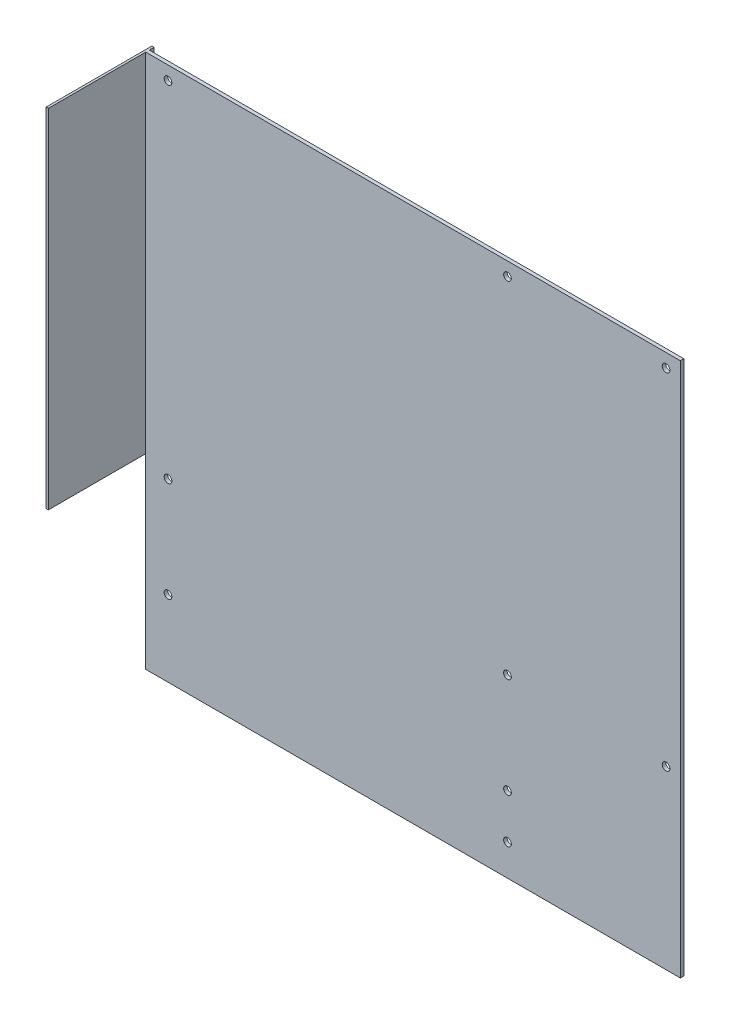
ISO-10303-21;
HEADER;
FILE_DESCRIPTION(('STEP AP214'),'2;1');
FILE_NAME('part.step','',(''),(''),'','','');
FILE_SCHEMA(('AUTOMOTIVE_DESIGN { 1 0 10303 214 1 1 1 1 }'));
ENDSEC;
DATA;
#1=APPLICATION_CONTEXT('core data for automotive mechanical design processes');
#2=APPLICATION_PROTOCOL_DEFINITION('international standard','automotive_design',2000,#1);
#3=PRODUCT_CONTEXT('',#1,'mechanical');
#4=PRODUCT('Part','Part','',(#3));
#5=PRODUCT_RELATED_PRODUCT_CATEGORY('part','',(#4));
#6=PRODUCT_DEFINITION_FORMATION('','',#4);
#7=PRODUCT_DEFINITION_CONTEXT('part definition',#1,'design');
#8=PRODUCT_DEFINITION('design','',#6,#7);
#9=PRODUCT_DEFINITION_SHAPE('','',#8);
#10=(LENGTH_UNIT() NAMED_UNIT(*) SI_UNIT(.MILLI.,.METRE.));
#11=(NAMED_UNIT(*) PLANE_ANGLE_UNIT() SI_UNIT($,.RADIAN.));
#12=(NAMED_UNIT(*) SI_UNIT($,.STERADIAN.) SOLID_ANGLE_UNIT());
#13=UNCERTAINTY_MEASURE_WITH_UNIT(LENGTH_MEASURE(1.E-05),#10,'distance_accuracy_value','');
#14=(GEOMETRIC_REPRESENTATION_CONTEXT(3) GLOBAL_UNCERTAINTY_ASSIGNED_CONTEXT((#13)) GLOBAL_UNIT_ASSIGNED_CONTEXT((#10,
#11,#12)) REPRESENTATION_CONTEXT('',''));
#15=CARTESIAN_POINT('',(0.,0.,0.));
#16=DIRECTION('',(0.,0.,1.));
#17=DIRECTION('',(1.,0.,0.));
#18=AXIS2_PLACEMENT_3D('',#15,#16,#17);
#19=CARTESIAN_POINT('',(0.,244.,1.6));
#20=DIRECTION('',(1.,0.,0.));
#21=DIRECTION('',(0.,1.,0.));
#22=AXIS2_PLACEMENT_3D('',#19,#20,#21);
#23=PLANE('',#22);
#24=DIRECTION('',(0.,0.,1.));
#25=VECTOR('',#24,1.);
#26=CARTESIAN_POINT('',(0.,85.25,-2.21));
#27=LINE('',#26,#25);
#28=CARTESIAN_POINT('',(0.,85.25,0.));
#29=VERTEX_POINT('',#28);
#30=CARTESIAN_POINT('',(0.,85.25,1.6));
#31=VERTEX_POINT('',#30);
#32=EDGE_CURVE('E11',#29,#31,#27,.T.);
#33=ORIENTED_EDGE('',*,*,#32,.F.);
#34=DIRECTION('',(0.,-1.,0.));
#35=VECTOR('',#34,1.);
#36=CARTESIAN_POINT('',(0.,244.,0.));
#37=LINE('',#36,#35);
#38=CARTESIAN_POINT('',(0.,0.,0.));
#39=VERTEX_POINT('',#38);
#40=EDGE_CURVE('E250',#29,#39,#37,.T.);
#41=ORIENTED_EDGE('',*,*,#40,.T.);
#42=DIRECTION('',(0.,0.,-1.));
#43=VECTOR('',#42,1.);
#44=CARTESIAN_POINT('',(0.,0.,1.6));
#45=LINE('',#44,#43);
#46=CARTESIAN_POINT('',(0.,0.,1.6));
#47=VERTEX_POINT('',#46);
#48=EDGE_CURVE('E48',#47,#39,#45,.T.);
#49=ORIENTED_EDGE('',*,*,#48,.F.);
#50=DIRECTION('',(0.,-1.,0.));
#51=VECTOR('',#50,1.);
#52=CARTESIAN_POINT('',(0.,244.,1.6));
#53=LINE('',#52,#51);
#54=EDGE_CURVE('E96',#31,#47,#53,.T.);
#55=ORIENTED_EDGE('',*,*,#54,.F.);
#56=EDGE_LOOP('',(#33,#41,#49,#55));
#57=FACE_BOUND('',#56,.T.);
#58=ADVANCED_FACE('F45',(#57),#23,.F.);
#59=CARTESIAN_POINT('',(0.,0.,1.6));
#60=DIRECTION('',(0.,1.,0.));
#61=DIRECTION('',(0.,0.,1.));
#62=AXIS2_PLACEMENT_3D('',#59,#60,#61);
#63=PLANE('',#62);
#64=DIRECTION('',(1.,0.,0.));
#65=VECTOR('',#64,1.);
#66=CARTESIAN_POINT('',(0.,0.,0.));
#67=LINE('',#66,#65);
#68=CARTESIAN_POINT('',(244.,0.,0.));
#69=VERTEX_POINT('',#68);
#70=EDGE_CURVE('E269',#39,#69,#67,.T.);
#71=ORIENTED_EDGE('',*,*,#70,.T.);
#72=DIRECTION('',(0.,0.,-1.));
#73=VECTOR('',#72,1.);
#74=CARTESIAN_POINT('',(244.,0.,1.6));
#75=LINE('',#74,#73);
#76=CARTESIAN_POINT('',(244.,0.,1.6));
#77=VERTEX_POINT('',#76);
#78=EDGE_CURVE('E278',#77,#69,#75,.T.);
#79=ORIENTED_EDGE('',*,*,#78,.F.);
#80=DIRECTION('',(1.,0.,0.));
#81=VECTOR('',#80,1.);
#82=CARTESIAN_POINT('',(0.,0.,1.6));
#83=LINE('',#82,#81);
#84=EDGE_CURVE('E256',#47,#77,#83,.T.);
#85=ORIENTED_EDGE('',*,*,#84,.F.);
#86=ORIENTED_EDGE('',*,*,#48,.T.);
#87=EDGE_LOOP('',(#71,#79,#85,#86));
#88=FACE_BOUND('',#87,.T.);
#89=ADVANCED_FACE('F289',(#88),#63,.F.);
#90=CARTESIAN_POINT('',(244.,0.,1.6));
#91=DIRECTION('',(-1.,0.,0.));
#92=DIRECTION('',(0.,0.,1.));
#93=AXIS2_PLACEMENT_3D('',#90,#91,#92);
#94=PLANE('',#93);
#95=DIRECTION('',(0.,1.,0.));
#96=VECTOR('',#95,1.);
#97=CARTESIAN_POINT('',(244.,0.,0.));
#98=LINE('',#97,#96);
#99=CARTESIAN_POINT('',(244.,244.,0.));
#100=VERTEX_POINT('',#99);
#101=EDGE_CURVE('E272',#69,#100,#98,.T.);
#102=ORIENTED_EDGE('',*,*,#101,.T.);
#103=DIRECTION('',(0.,0.,-1.));
#104=VECTOR('',#103,1.);
#105=CARTESIAN_POINT('',(244.,244.,1.6));
#106=LINE('',#105,#104);
#107=CARTESIAN_POINT('',(244.,244.,1.6));
#108=VERTEX_POINT('',#107);
#109=EDGE_CURVE('E264',#108,#100,#106,.T.);
#110=ORIENTED_EDGE('',*,*,#109,.F.);
#111=DIRECTION('',(0.,1.,0.));
#112=VECTOR('',#111,1.);
#113=CARTESIAN_POINT('',(244.,0.,1.6));
#114=LINE('',#113,#112);
#115=EDGE_CURVE('E259',#77,#108,#114,.T.);
#116=ORIENTED_EDGE('',*,*,#115,.F.);
#117=ORIENTED_EDGE('',*,*,#78,.T.);
#118=EDGE_LOOP('',(#102,#110,#116,#117));
#119=FACE_BOUND('',#118,.T.);
#120=ADVANCED_FACE('F295',(#119),#94,.F.);
#121=CARTESIAN_POINT('',(244.,244.,1.6));
#122=DIRECTION('',(0.,-1.,0.));
#123=DIRECTION('',(1.,0.,0.));
#124=AXIS2_PLACEMENT_3D('',#121,#122,#123);
#125=PLANE('',#124);
#126=DIRECTION('',(-1.,0.,0.));
#127=VECTOR('',#126,1.);
#128=CARTESIAN_POINT('',(244.,244.,0.));
#129=LINE('',#128,#127);
#130=CARTESIAN_POINT('',(0.,244.,0.));
#131=VERTEX_POINT('',#130);
#132=EDGE_CURVE('E91',#100,#131,#129,.T.);
#133=ORIENTED_EDGE('',*,*,#132,.T.);
#134=DIRECTION('',(0.,0.,1.));
#135=VECTOR('',#134,1.);
#136=CARTESIAN_POINT('',(0.,244.,-2.21));
#137=LINE('',#136,#135);
#138=CARTESIAN_POINT('',(0.,244.,-2.21));
#139=VERTEX_POINT('',#138);
#140=EDGE_CURVE('E133',#139,#131,#137,.T.);
#141=ORIENTED_EDGE('',*,*,#140,.F.);
#142=DIRECTION('',(-1.,0.,0.));
#143=VECTOR('',#142,1.);
#144=CARTESIAN_POINT('',(0.,244.,-2.21));
#145=LINE('',#144,#143);
#146=CARTESIAN_POINT('',(-1.,244.,-2.21));
#147=VERTEX_POINT('',#146);
#148=EDGE_CURVE('E162',#139,#147,#145,.T.);
#149=ORIENTED_EDGE('',*,*,#148,.T.);
#150=DIRECTION('',(0.,0.,1.));
#151=VECTOR('',#150,1.);
#152=CARTESIAN_POINT('',(-1.,244.,-2.21));
#153=LINE('',#152,#151);
#154=CARTESIAN_POINT('',(-1.,244.,46.05));
#155=VERTEX_POINT('',#154);
#156=EDGE_CURVE('E140',#147,#155,#153,.T.);
#157=ORIENTED_EDGE('',*,*,#156,.T.);
#158=DIRECTION('',(-1.,0.,0.));
#159=VECTOR('',#158,1.);
#160=CARTESIAN_POINT('',(0.,244.,46.05));
#161=LINE('',#160,#159);
#162=CARTESIAN_POINT('',(0.,244.,46.05));
#163=VERTEX_POINT('',#162);
#164=EDGE_CURVE('E137',#163,#155,#161,.T.);
#165=ORIENTED_EDGE('',*,*,#164,.F.);
#166=CARTESIAN_POINT('',(0.,244.,1.6));
#167=VERTEX_POINT('',#166);
#168=EDGE_CURVE('E125',#167,#163,#137,.T.);
#169=ORIENTED_EDGE('',*,*,#168,.F.);
#170=DIRECTION('',(-1.,0.,0.));
#171=VECTOR('',#170,1.);
#172=CARTESIAN_POINT('',(244.,244.,1.6));
#173=LINE('',#172,#171);
#174=EDGE_CURVE('E70',#108,#167,#173,.T.);
#175=ORIENTED_EDGE('',*,*,#174,.F.);
#176=ORIENTED_EDGE('',*,*,#109,.T.);
#177=EDGE_LOOP('',(#133,#141,#149,#157,#165,#169,#175,#176));
#178=FACE_BOUND('',#177,.T.);
#179=ADVANCED_FACE('F138',(#178),#125,.F.);
#180=CARTESIAN_POINT('',(0.,0.,1.6));
#181=DIRECTION('',(0.,0.,1.));
#182=DIRECTION('',(1.,0.,0.));
#183=AXIS2_PLACEMENT_3D('',#180,#181,#182);
#184=PLANE('',#183);
#185=CARTESIAN_POINT('',(165.1,14.31,1.6));
#186=DIRECTION('',(0.,0.,1.));
#187=DIRECTION('',(1.,0.,0.));
#188=AXIS2_PLACEMENT_3D('',#185,#186,#187);
#189=CIRCLE('',#188,1.75000000000001);
#190=CARTESIAN_POINT('',(166.85,14.31,1.6));
#191=VERTEX_POINT('',#190);
#192=EDGE_CURVE('E214',#191,#191,#189,.T.);
#193=ORIENTED_EDGE('',*,*,#192,.F.);
#194=EDGE_LOOP('',(#193));
#195=FACE_BOUND('',#194,.T.);
#196=CARTESIAN_POINT('',(165.1,34.6299999999999,1.6));
#197=DIRECTION('',(0.,0.,1.));
#198=DIRECTION('',(1.,0.,0.));
#199=AXIS2_PLACEMENT_3D('',#196,#197,#198);
#200=CIRCLE('',#199,1.75000000000001);
#201=CARTESIAN_POINT('',(166.85,34.6299999999999,1.6));
#202=VERTEX_POINT('',#201);
#203=EDGE_CURVE('E223',#202,#202,#200,.T.);
#204=ORIENTED_EDGE('',*,*,#203,.F.);
#205=EDGE_LOOP('',(#204));
#206=FACE_BOUND('',#205,.T.);
#207=CARTESIAN_POINT('',(10.16,80.35,1.6));
#208=DIRECTION('',(0.,0.,1.));
#209=DIRECTION('',(1.,0.,0.));
#210=AXIS2_PLACEMENT_3D('',#207,#208,#209);
#211=CIRCLE('',#210,1.75);
#212=CARTESIAN_POINT('',(11.91,80.35,1.6));
#213=VERTEX_POINT('',#212);
#214=EDGE_CURVE('E231',#213,#213,#211,.T.);
#215=ORIENTED_EDGE('',*,*,#214,.F.);
#216=EDGE_LOOP('',(#215));
#217=FACE_BOUND('',#216,.T.);
#218=CARTESIAN_POINT('',(165.1,80.3499999999999,1.6));
#219=DIRECTION('',(0.,0.,1.));
#220=DIRECTION('',(1.,0.,0.));
#221=AXIS2_PLACEMENT_3D('',#218,#219,#220);
#222=CIRCLE('',#221,1.75000000000001);
#223=CARTESIAN_POINT('',(166.85,80.3499999999999,1.6));
#224=VERTEX_POINT('',#223);
#225=EDGE_CURVE('E239',#224,#224,#222,.T.);
#226=ORIENTED_EDGE('',*,*,#225,.F.);
#227=EDGE_LOOP('',(#226));
#228=FACE_BOUND('',#227,.T.);
#229=CARTESIAN_POINT('',(165.1,237.83,1.6));
#230=DIRECTION('',(0.,0.,1.));
#231=DIRECTION('',(1.,0.,0.));
#232=AXIS2_PLACEMENT_3D('',#229,#230,#231);
#233=CIRCLE('',#232,1.74999999999998);
#234=CARTESIAN_POINT('',(166.85,237.83,1.6));
#235=VERTEX_POINT('',#234);
#236=EDGE_CURVE('E191',#235,#235,#233,.T.);
#237=ORIENTED_EDGE('',*,*,#236,.F.);
#238=EDGE_LOOP('',(#237));
#239=FACE_BOUND('',#238,.T.);
#240=CARTESIAN_POINT('',(237.49,237.83,1.6));
#241=DIRECTION('',(0.,0.,1.));
#242=DIRECTION('',(1.,0.,0.));
#243=AXIS2_PLACEMENT_3D('',#240,#241,#242);
#244=CIRCLE('',#243,1.75000000000004);
#245=CARTESIAN_POINT('',(239.24,237.83,1.6));
#246=VERTEX_POINT('',#245);
#247=EDGE_CURVE('E182',#246,#246,#244,.T.);
#248=ORIENTED_EDGE('',*,*,#247,.F.);
#249=EDGE_LOOP('',(#248));
#250=FACE_BOUND('',#249,.T.);
#251=CARTESIAN_POINT('',(10.16,237.83,1.6));
#252=DIRECTION('',(0.,0.,1.));
#253=DIRECTION('',(1.,0.,0.));
#254=AXIS2_PLACEMENT_3D('',#251,#252,#253);
#255=CIRCLE('',#254,1.75);
#256=CARTESIAN_POINT('',(11.91,237.83,1.6));
#257=VERTEX_POINT('',#256);
#258=EDGE_CURVE('E207',#257,#257,#255,.T.);
#259=ORIENTED_EDGE('',*,*,#258,.F.);
#260=EDGE_LOOP('',(#259));
#261=FACE_BOUND('',#260,.T.);
#262=CARTESIAN_POINT('',(237.49,80.3499999999999,1.6));
#263=DIRECTION('',(0.,0.,1.));
#264=DIRECTION('',(1.,0.,0.));
#265=AXIS2_PLACEMENT_3D('',#262,#263,#264);
#266=CIRCLE('',#265,1.75000000000001);
#267=CARTESIAN_POINT('',(239.24,80.3499999999999,1.6));
#268=VERTEX_POINT('',#267);
#269=EDGE_CURVE('E198',#268,#268,#266,.T.);
#270=ORIENTED_EDGE('',*,*,#269,.F.);
#271=EDGE_LOOP('',(#270));
#272=FACE_BOUND('',#271,.T.);
#273=CARTESIAN_POINT('',(10.16,34.63,1.6));
#274=DIRECTION('',(0.,0.,1.));
#275=DIRECTION('',(1.,0.,0.));
#276=AXIS2_PLACEMENT_3D('',#273,#274,#275);
#277=CIRCLE('',#276,1.75);
#278=CARTESIAN_POINT('',(11.91,34.63,1.6));
#279=VERTEX_POINT('',#278);
#280=EDGE_CURVE('E218',#279,#279,#277,.T.);
#281=ORIENTED_EDGE('',*,*,#280,.F.);
#282=EDGE_LOOP('',(#281));
#283=FACE_BOUND('',#282,.T.);
#284=EDGE_CURVE('E131',#167,#31,#53,.T.);
#285=ORIENTED_EDGE('',*,*,#284,.T.);
#286=ORIENTED_EDGE('',*,*,#54,.T.);
#287=ORIENTED_EDGE('',*,*,#84,.T.);
#288=ORIENTED_EDGE('',*,*,#115,.T.);
#289=ORIENTED_EDGE('',*,*,#174,.T.);
#290=EDGE_LOOP('',(#285,#286,#287,#288,#289));
#291=FACE_BOUND('',#290,.T.);
#292=ADVANCED_FACE('F296',(#195,#206,#217,#228,#239,#250,#261,#272,#283,#291),#184,.T.);
#293=CARTESIAN_POINT('',(0.,0.,0.));
#294=DIRECTION('',(0.,0.,1.));
#295=DIRECTION('',(1.,0.,0.));
#296=AXIS2_PLACEMENT_3D('',#293,#294,#295);
#297=PLANE('',#296);
#298=CARTESIAN_POINT('',(165.1,14.31,0.));
#299=DIRECTION('',(0.,0.,1.));
#300=DIRECTION('',(1.,0.,0.));
#301=AXIS2_PLACEMENT_3D('',#298,#299,#300);
#302=CIRCLE('',#301,1.75000000000001);
#303=CARTESIAN_POINT('',(166.85,14.31,0.));
#304=VERTEX_POINT('',#303);
#305=EDGE_CURVE('E219',#304,#304,#302,.T.);
#306=ORIENTED_EDGE('',*,*,#305,.T.);
#307=EDGE_LOOP('',(#306));
#308=FACE_BOUND('',#307,.T.);
#309=CARTESIAN_POINT('',(165.1,34.6299999999999,0.));
#310=DIRECTION('',(0.,0.,1.));
#311=DIRECTION('',(1.,0.,0.));
#312=AXIS2_PLACEMENT_3D('',#309,#310,#311);
#313=CIRCLE('',#312,1.75000000000001);
#314=CARTESIAN_POINT('',(166.85,34.6299999999999,0.));
#315=VERTEX_POINT('',#314);
#316=EDGE_CURVE('E227',#315,#315,#313,.T.);
#317=ORIENTED_EDGE('',*,*,#316,.T.);
#318=EDGE_LOOP('',(#317));
#319=FACE_BOUND('',#318,.T.);
#320=CARTESIAN_POINT('',(10.16,80.35,0.));
#321=DIRECTION('',(0.,0.,1.));
#322=DIRECTION('',(1.,0.,0.));
#323=AXIS2_PLACEMENT_3D('',#320,#321,#322);
#324=CIRCLE('',#323,1.75);
#325=CARTESIAN_POINT('',(11.91,80.35,0.));
#326=VERTEX_POINT('',#325);
#327=EDGE_CURVE('E235',#326,#326,#324,.T.);
#328=ORIENTED_EDGE('',*,*,#327,.T.);
#329=EDGE_LOOP('',(#328));
#330=FACE_BOUND('',#329,.T.);
#331=CARTESIAN_POINT('',(165.1,80.3499999999999,0.));
#332=DIRECTION('',(0.,0.,1.));
#333=DIRECTION('',(1.,0.,0.));
#334=AXIS2_PLACEMENT_3D('',#331,#332,#333);
#335=CIRCLE('',#334,1.75000000000001);
#336=CARTESIAN_POINT('',(166.85,80.3499999999999,0.));
#337=VERTEX_POINT('',#336);
#338=EDGE_CURVE('E202',#337,#337,#335,.T.);
#339=ORIENTED_EDGE('',*,*,#338,.T.);
#340=EDGE_LOOP('',(#339));
#341=FACE_BOUND('',#340,.T.);
#342=CARTESIAN_POINT('',(165.1,237.83,0.));
#343=DIRECTION('',(0.,0.,1.));
#344=DIRECTION('',(1.,0.,0.));
#345=AXIS2_PLACEMENT_3D('',#342,#343,#344);
#346=CIRCLE('',#345,1.74999999999998);
#347=CARTESIAN_POINT('',(166.85,237.83,0.));
#348=VERTEX_POINT('',#347);
#349=EDGE_CURVE('E174',#348,#348,#346,.T.);
#350=ORIENTED_EDGE('',*,*,#349,.T.);
#351=EDGE_LOOP('',(#350));
#352=FACE_BOUND('',#351,.T.);
#353=CARTESIAN_POINT('',(237.49,237.83,0.));
#354=DIRECTION('',(0.,0.,1.));
#355=DIRECTION('',(1.,0.,0.));
#356=AXIS2_PLACEMENT_3D('',#353,#354,#355);
#357=CIRCLE('',#356,1.75000000000004);
#358=CARTESIAN_POINT('',(239.24,237.83,0.));
#359=VERTEX_POINT('',#358);
#360=EDGE_CURVE('E187',#359,#359,#357,.T.);
#361=ORIENTED_EDGE('',*,*,#360,.T.);
#362=EDGE_LOOP('',(#361));
#363=FACE_BOUND('',#362,.T.);
#364=CARTESIAN_POINT('',(10.16,237.83,0.));
#365=DIRECTION('',(0.,0.,1.));
#366=DIRECTION('',(1.,0.,0.));
#367=AXIS2_PLACEMENT_3D('',#364,#365,#366);
#368=CIRCLE('',#367,1.75);
#369=CARTESIAN_POINT('',(11.91,237.83,0.));
#370=VERTEX_POINT('',#369);
#371=EDGE_CURVE('E186',#370,#370,#368,.T.);
#372=ORIENTED_EDGE('',*,*,#371,.T.);
#373=EDGE_LOOP('',(#372));
#374=FACE_BOUND('',#373,.T.);
#375=CARTESIAN_POINT('',(237.49,80.3499999999999,0.));
#376=DIRECTION('',(0.,0.,1.));
#377=DIRECTION('',(1.,0.,0.));
#378=AXIS2_PLACEMENT_3D('',#375,#376,#377);
#379=CIRCLE('',#378,1.75000000000001);
#380=CARTESIAN_POINT('',(239.24,80.3499999999999,0.));
#381=VERTEX_POINT('',#380);
#382=EDGE_CURVE('E203',#381,#381,#379,.T.);
#383=ORIENTED_EDGE('',*,*,#382,.T.);
#384=EDGE_LOOP('',(#383));
#385=FACE_BOUND('',#384,.T.);
#386=CARTESIAN_POINT('',(10.16,34.63,0.));
#387=DIRECTION('',(0.,0.,1.));
#388=DIRECTION('',(1.,0.,0.));
#389=AXIS2_PLACEMENT_3D('',#386,#387,#388);
#390=CIRCLE('',#389,1.75);
#391=CARTESIAN_POINT('',(11.91,34.63,0.));
#392=VERTEX_POINT('',#391);
#393=EDGE_CURVE('E246',#392,#392,#390,.T.);
#394=ORIENTED_EDGE('',*,*,#393,.T.);
#395=EDGE_LOOP('',(#394));
#396=FACE_BOUND('',#395,.T.);
#397=EDGE_CURVE('E265',#131,#29,#37,.T.);
#398=ORIENTED_EDGE('',*,*,#397,.F.);
#399=ORIENTED_EDGE('',*,*,#132,.F.);
#400=ORIENTED_EDGE('',*,*,#101,.F.);
#401=ORIENTED_EDGE('',*,*,#70,.F.);
#402=ORIENTED_EDGE('',*,*,#40,.F.);
#403=EDGE_LOOP('',(#398,#399,#400,#401,#402));
#404=FACE_BOUND('',#403,.T.);
#405=ADVANCED_FACE('F293',(#308,#319,#330,#341,#352,#363,#374,#385,#396,#404),#297,.F.);
#406=CARTESIAN_POINT('',(10.16,34.63,0.));
#407=DIRECTION('',(0.,0.,1.));
#408=DIRECTION('',(1.,0.,0.));
#409=AXIS2_PLACEMENT_3D('',#406,#407,#408);
#410=CYLINDRICAL_SURFACE('',#409,1.75);
#411=ORIENTED_EDGE('',*,*,#393,.F.);
#412=EDGE_LOOP('',(#411));
#413=FACE_BOUND('',#412,.T.);
#414=ORIENTED_EDGE('',*,*,#280,.T.);
#415=EDGE_LOOP('',(#414));
#416=FACE_BOUND('',#415,.T.);
#417=ADVANCED_FACE('F304',(#413,#416),#410,.F.);
#418=CARTESIAN_POINT('',(237.49,80.3499999999999,0.));
#419=DIRECTION('',(0.,0.,1.));
#420=DIRECTION('',(1.,0.,0.));
#421=AXIS2_PLACEMENT_3D('',#418,#419,#420);
#422=CYLINDRICAL_SURFACE('',#421,1.75000000000001);
#423=ORIENTED_EDGE('',*,*,#382,.F.);
#424=EDGE_LOOP('',(#423));
#425=FACE_BOUND('',#424,.T.);
#426=ORIENTED_EDGE('',*,*,#269,.T.);
#427=EDGE_LOOP('',(#426));
#428=FACE_BOUND('',#427,.T.);
#429=ADVANCED_FACE('F330',(#425,#428),#422,.F.);
#430=CARTESIAN_POINT('',(10.16,237.83,0.));
#431=DIRECTION('',(0.,0.,1.));
#432=DIRECTION('',(1.,0.,0.));
#433=AXIS2_PLACEMENT_3D('',#430,#431,#432);
#434=CYLINDRICAL_SURFACE('',#433,1.75);
#435=ORIENTED_EDGE('',*,*,#371,.F.);
#436=EDGE_LOOP('',(#435));
#437=FACE_BOUND('',#436,.T.);
#438=ORIENTED_EDGE('',*,*,#258,.T.);
#439=EDGE_LOOP('',(#438));
#440=FACE_BOUND('',#439,.T.);
#441=ADVANCED_FACE('F339',(#437,#440),#434,.F.);
#442=CARTESIAN_POINT('',(237.49,237.83,0.));
#443=DIRECTION('',(0.,0.,1.));
#444=DIRECTION('',(1.,0.,0.));
#445=AXIS2_PLACEMENT_3D('',#442,#443,#444);
#446=CYLINDRICAL_SURFACE('',#445,1.75000000000004);
#447=ORIENTED_EDGE('',*,*,#360,.F.);
#448=EDGE_LOOP('',(#447));
#449=FACE_BOUND('',#448,.T.);
#450=ORIENTED_EDGE('',*,*,#247,.T.);
#451=EDGE_LOOP('',(#450));
#452=FACE_BOUND('',#451,.T.);
#453=ADVANCED_FACE('F348',(#449,#452),#446,.F.);
#454=CARTESIAN_POINT('',(165.1,237.83,0.));
#455=DIRECTION('',(0.,0.,1.));
#456=DIRECTION('',(1.,0.,0.));
#457=AXIS2_PLACEMENT_3D('',#454,#455,#456);
#458=CYLINDRICAL_SURFACE('',#457,1.74999999999998);
#459=ORIENTED_EDGE('',*,*,#349,.F.);
#460=EDGE_LOOP('',(#459));
#461=FACE_BOUND('',#460,.T.);
#462=ORIENTED_EDGE('',*,*,#236,.T.);
#463=EDGE_LOOP('',(#462));
#464=FACE_BOUND('',#463,.T.);
#465=ADVANCED_FACE('F357',(#461,#464),#458,.F.);
#466=CARTESIAN_POINT('',(165.1,80.3499999999999,0.));
#467=DIRECTION('',(0.,0.,1.));
#468=DIRECTION('',(1.,0.,0.));
#469=AXIS2_PLACEMENT_3D('',#466,#467,#468);
#470=CYLINDRICAL_SURFACE('',#469,1.75000000000001);
#471=ORIENTED_EDGE('',*,*,#338,.F.);
#472=EDGE_LOOP('',(#471));
#473=FACE_BOUND('',#472,.T.);
#474=ORIENTED_EDGE('',*,*,#225,.T.);
#475=EDGE_LOOP('',(#474));
#476=FACE_BOUND('',#475,.T.);
#477=ADVANCED_FACE('F366',(#473,#476),#470,.F.);
#478=CARTESIAN_POINT('',(10.16,80.35,0.));
#479=DIRECTION('',(0.,0.,1.));
#480=DIRECTION('',(1.,0.,0.));
#481=AXIS2_PLACEMENT_3D('',#478,#479,#480);
#482=CYLINDRICAL_SURFACE('',#481,1.75);
#483=ORIENTED_EDGE('',*,*,#327,.F.);
#484=EDGE_LOOP('',(#483));
#485=FACE_BOUND('',#484,.T.);
#486=ORIENTED_EDGE('',*,*,#214,.T.);
#487=EDGE_LOOP('',(#486));
#488=FACE_BOUND('',#487,.T.);
#489=ADVANCED_FACE('F375',(#485,#488),#482,.F.);
#490=CARTESIAN_POINT('',(165.1,34.6299999999999,0.));
#491=DIRECTION('',(0.,0.,1.));
#492=DIRECTION('',(1.,0.,0.));
#493=AXIS2_PLACEMENT_3D('',#490,#491,#492);
#494=CYLINDRICAL_SURFACE('',#493,1.75000000000001);
#495=ORIENTED_EDGE('',*,*,#316,.F.);
#496=EDGE_LOOP('',(#495));
#497=FACE_BOUND('',#496,.T.);
#498=ORIENTED_EDGE('',*,*,#203,.T.);
#499=EDGE_LOOP('',(#498));
#500=FACE_BOUND('',#499,.T.);
#501=ADVANCED_FACE('F384',(#497,#500),#494,.F.);
#502=CARTESIAN_POINT('',(165.1,14.31,0.));
#503=DIRECTION('',(0.,0.,1.));
#504=DIRECTION('',(1.,0.,0.));
#505=AXIS2_PLACEMENT_3D('',#502,#503,#504);
#506=CYLINDRICAL_SURFACE('',#505,1.75000000000001);
#507=ORIENTED_EDGE('',*,*,#305,.F.);
#508=EDGE_LOOP('',(#507));
#509=FACE_BOUND('',#508,.T.);
#510=ORIENTED_EDGE('',*,*,#192,.T.);
#511=EDGE_LOOP('',(#510));
#512=FACE_BOUND('',#511,.T.);
#513=ADVANCED_FACE('F392',(#509,#512),#506,.F.);
#514=CARTESIAN_POINT('',(0.,244.,-2.21));
#515=DIRECTION('',(1.,0.,0.));
#516=DIRECTION('',(0.,0.,-1.));
#517=AXIS2_PLACEMENT_3D('',#514,#515,#516);
#518=PLANE('',#517);
#519=ORIENTED_EDGE('',*,*,#284,.F.);
#520=ORIENTED_EDGE('',*,*,#168,.T.);
#521=DIRECTION('',(0.,1.,0.));
#522=VECTOR('',#521,1.);
#523=CARTESIAN_POINT('',(0.,244.,46.05));
#524=LINE('',#523,#522);
#525=CARTESIAN_POINT('',(0.,85.25,46.05));
#526=VERTEX_POINT('',#525);
#527=EDGE_CURVE('E130',#526,#163,#524,.T.);
#528=ORIENTED_EDGE('',*,*,#527,.F.);
#529=EDGE_CURVE('E56',#31,#526,#27,.T.);
#530=ORIENTED_EDGE('',*,*,#529,.F.);
#531=EDGE_LOOP('',(#519,#520,#528,#530));
#532=FACE_BOUND('',#531,.T.);
#533=ADVANCED_FACE('F127',(#532),#518,.T.);
#534=ORIENTED_EDGE('',*,*,#140,.T.);
#535=ORIENTED_EDGE('',*,*,#397,.T.);
#536=CARTESIAN_POINT('',(0.,85.25,-2.21));
#537=VERTEX_POINT('',#536);
#538=EDGE_CURVE('E55',#537,#29,#27,.T.);
#539=ORIENTED_EDGE('',*,*,#538,.F.);
#540=DIRECTION('',(0.,1.,0.));
#541=VECTOR('',#540,1.);
#542=CARTESIAN_POINT('',(0.,244.,-2.21));
#543=LINE('',#542,#541);
#544=EDGE_CURVE('E158',#537,#139,#543,.T.);
#545=ORIENTED_EDGE('',*,*,#544,.T.);
#546=EDGE_LOOP('',(#534,#535,#539,#545));
#547=FACE_BOUND('',#546,.T.);
#548=ADVANCED_FACE('F423',(#547),#518,.T.);
#549=CARTESIAN_POINT('',(-0.999999999999982,85.25,-2.21));
#550=DIRECTION('',(0.,-1.,0.));
#551=DIRECTION('',(0.,0.,-1.));
#552=AXIS2_PLACEMENT_3D('',#549,#550,#551);
#553=PLANE('',#552);
#554=ORIENTED_EDGE('',*,*,#538,.T.);
#555=ORIENTED_EDGE('',*,*,#32,.T.);
#556=ORIENTED_EDGE('',*,*,#529,.T.);
#557=DIRECTION('',(1.,0.,0.));
#558=VECTOR('',#557,1.);
#559=CARTESIAN_POINT('',(-0.999999999999982,85.25,46.05));
#560=LINE('',#559,#558);
#561=CARTESIAN_POINT('',(-0.999999999999982,85.25,46.05));
#562=VERTEX_POINT('',#561);
#563=EDGE_CURVE('E150',#562,#526,#560,.T.);
#564=ORIENTED_EDGE('',*,*,#563,.F.);
#565=DIRECTION('',(0.,0.,1.));
#566=VECTOR('',#565,1.);
#567=CARTESIAN_POINT('',(-0.999999999999982,85.25,-2.21));
#568=LINE('',#567,#566);
#569=CARTESIAN_POINT('',(-0.999999999999982,85.25,-2.21));
#570=VERTEX_POINT('',#569);
#571=EDGE_CURVE('E175',#570,#562,#568,.T.);
#572=ORIENTED_EDGE('',*,*,#571,.F.);
#573=DIRECTION('',(1.,0.,0.));
#574=VECTOR('',#573,1.);
#575=CARTESIAN_POINT('',(-0.999999999999982,85.25,-2.21));
#576=LINE('',#575,#574);
#577=EDGE_CURVE('E134',#570,#537,#576,.T.);
#578=ORIENTED_EDGE('',*,*,#577,.T.);
#579=EDGE_LOOP('',(#554,#555,#556,#564,#572,#578));
#580=FACE_BOUND('',#579,.T.);
#581=ADVANCED_FACE('F432',(#580),#553,.T.);
#582=CARTESIAN_POINT('',(-1.,244.,-2.21));
#583=DIRECTION('',(-1.,0.,0.));
#584=DIRECTION('',(0.,-1.,0.));
#585=AXIS2_PLACEMENT_3D('',#582,#583,#584);
#586=PLANE('',#585);
#587=ORIENTED_EDGE('',*,*,#571,.T.);
#588=DIRECTION('',(0.,-1.,0.));
#589=VECTOR('',#588,1.);
#590=CARTESIAN_POINT('',(-1.,244.,46.05));
#591=LINE('',#590,#589);
#592=EDGE_CURVE('E145',#155,#562,#591,.T.);
#593=ORIENTED_EDGE('',*,*,#592,.F.);
#594=ORIENTED_EDGE('',*,*,#156,.F.);
#595=DIRECTION('',(0.,-1.,0.));
#596=VECTOR('',#595,1.);
#597=CARTESIAN_POINT('',(-1.,244.,-2.21));
#598=LINE('',#597,#596);
#599=EDGE_CURVE('E165',#147,#570,#598,.T.);
#600=ORIENTED_EDGE('',*,*,#599,.T.);
#601=EDGE_LOOP('',(#587,#593,#594,#600));
#602=FACE_BOUND('',#601,.T.);
#603=ADVANCED_FACE('F441',(#602),#586,.T.);
#604=CARTESIAN_POINT('',(0.,0.,-2.21));
#605=DIRECTION('',(0.,0.,1.));
#606=DIRECTION('',(1.,0.,0.));
#607=AXIS2_PLACEMENT_3D('',#604,#605,#606);
#608=PLANE('',#607);
#609=ORIENTED_EDGE('',*,*,#544,.F.);
#610=ORIENTED_EDGE('',*,*,#577,.F.);
#611=ORIENTED_EDGE('',*,*,#599,.F.);
#612=ORIENTED_EDGE('',*,*,#148,.F.);
#613=EDGE_LOOP('',(#609,#610,#611,#612));
#614=FACE_BOUND('',#613,.T.);
#615=ADVANCED_FACE('F451',(#614),#608,.F.);
#616=CARTESIAN_POINT('',(0.,0.,46.05));
#617=DIRECTION('',(0.,0.,1.));
#618=DIRECTION('',(1.,0.,0.));
#619=AXIS2_PLACEMENT_3D('',#616,#617,#618);
#620=PLANE('',#619);
#621=ORIENTED_EDGE('',*,*,#527,.T.);
#622=ORIENTED_EDGE('',*,*,#164,.T.);
#623=ORIENTED_EDGE('',*,*,#592,.T.);
#624=ORIENTED_EDGE('',*,*,#563,.T.);
#625=EDGE_LOOP('',(#621,#622,#623,#624));
#626=FACE_BOUND('',#625,.T.);
#627=ADVANCED_FACE('F148',(#626),#620,.T.);
#628=CLOSED_SHELL('',(#58,#89,#120,#179,#292,#405,#417,#429,#441,#453,#465,#477,#489,#501,#513,
#533,#548,#581,#603,#615,#627));
#629=MANIFOLD_SOLID_BREP('B2',#628);
#630=ADVANCED_BREP_SHAPE_REPRESENTATION('',(#18,#629),#14);
#631=SHAPE_DEFINITION_REPRESENTATION(#9,#630);
ENDSEC;
END-ISO-10303-21;
